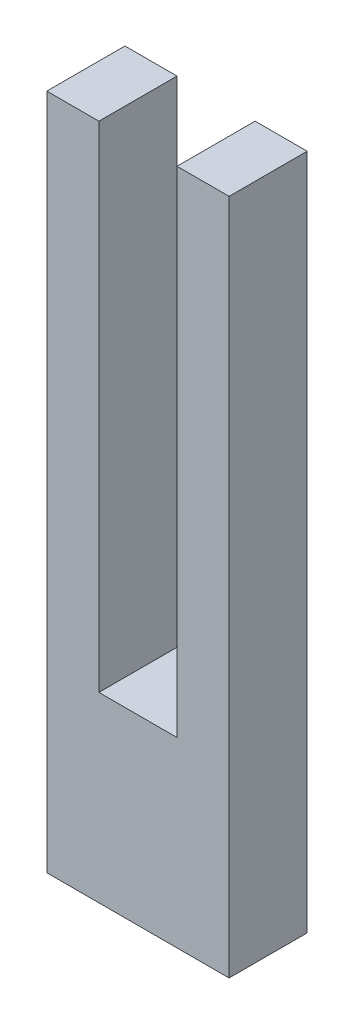
ISO-10303-21;
HEADER;
FILE_DESCRIPTION(('STEP AP214'),'2;1');
FILE_NAME('part.step','',(''),(''),'','','');
FILE_SCHEMA(('AUTOMOTIVE_DESIGN { 1 0 10303 214 1 1 1 1 }'));
ENDSEC;
DATA;
#1=APPLICATION_CONTEXT('core data for automotive mechanical design processes');
#2=APPLICATION_PROTOCOL_DEFINITION('international standard','automotive_design',2000,#1);
#3=PRODUCT_CONTEXT('',#1,'mechanical');
#4=PRODUCT('Part','Part','',(#3));
#5=PRODUCT_RELATED_PRODUCT_CATEGORY('part','',(#4));
#6=PRODUCT_DEFINITION_FORMATION('','',#4);
#7=PRODUCT_DEFINITION_CONTEXT('part definition',#1,'design');
#8=PRODUCT_DEFINITION('design','',#6,#7);
#9=PRODUCT_DEFINITION_SHAPE('','',#8);
#10=(LENGTH_UNIT() NAMED_UNIT(*) SI_UNIT(.MILLI.,.METRE.));
#11=(NAMED_UNIT(*) PLANE_ANGLE_UNIT() SI_UNIT($,.RADIAN.));
#12=(NAMED_UNIT(*) SI_UNIT($,.STERADIAN.) SOLID_ANGLE_UNIT());
#13=UNCERTAINTY_MEASURE_WITH_UNIT(LENGTH_MEASURE(1.E-05),#10,'distance_accuracy_value','');
#14=(GEOMETRIC_REPRESENTATION_CONTEXT(3) GLOBAL_UNCERTAINTY_ASSIGNED_CONTEXT((#13)) GLOBAL_UNIT_ASSIGNED_CONTEXT((#10,
#11,#12)) REPRESENTATION_CONTEXT('',''));
#15=CARTESIAN_POINT('',(0.,0.,0.));
#16=DIRECTION('',(0.,0.,1.));
#17=DIRECTION('',(1.,0.,0.));
#18=AXIS2_PLACEMENT_3D('',#15,#16,#17);
#19=CARTESIAN_POINT('',(0.,26.,3.));
#20=DIRECTION('',(1.,0.,0.));
#21=DIRECTION('',(0.,1.,0.));
#22=AXIS2_PLACEMENT_3D('',#19,#20,#21);
#23=PLANE('',#22);
#24=DIRECTION('',(0.,-1.,0.));
#25=VECTOR('',#24,1.);
#26=CARTESIAN_POINT('',(0.,26.,0.));
#27=LINE('',#26,#25);
#28=CARTESIAN_POINT('',(0.,26.,0.));
#29=VERTEX_POINT('',#28);
#30=CARTESIAN_POINT('',(0.,0.,0.));
#31=VERTEX_POINT('',#30);
#32=EDGE_CURVE('E147',#29,#31,#27,.T.);
#33=ORIENTED_EDGE('',*,*,#32,.T.);
#34=DIRECTION('',(0.,0.,-1.));
#35=VECTOR('',#34,1.);
#36=CARTESIAN_POINT('',(0.,0.,3.));
#37=LINE('',#36,#35);
#38=CARTESIAN_POINT('',(0.,0.,3.));
#39=VERTEX_POINT('',#38);
#40=EDGE_CURVE('E11',#39,#31,#37,.T.);
#41=ORIENTED_EDGE('',*,*,#40,.F.);
#42=DIRECTION('',(0.,-1.,0.));
#43=VECTOR('',#42,1.);
#44=CARTESIAN_POINT('',(0.,26.,3.));
#45=LINE('',#44,#43);
#46=CARTESIAN_POINT('',(0.,26.,3.));
#47=VERTEX_POINT('',#46);
#48=EDGE_CURVE('E166',#47,#39,#45,.T.);
#49=ORIENTED_EDGE('',*,*,#48,.F.);
#50=DIRECTION('',(0.,0.,-1.));
#51=VECTOR('',#50,1.);
#52=CARTESIAN_POINT('',(0.,26.,3.));
#53=LINE('',#52,#51);
#54=EDGE_CURVE('E145',#47,#29,#53,.T.);
#55=ORIENTED_EDGE('',*,*,#54,.T.);
#56=EDGE_LOOP('',(#33,#41,#49,#55));
#57=FACE_BOUND('',#56,.T.);
#58=ADVANCED_FACE('F44',(#57),#23,.F.);
#59=CARTESIAN_POINT('',(0.,0.,3.));
#60=DIRECTION('',(0.,1.,0.));
#61=DIRECTION('',(0.,0.,1.));
#62=AXIS2_PLACEMENT_3D('',#59,#60,#61);
#63=PLANE('',#62);
#64=DIRECTION('',(1.,0.,0.));
#65=VECTOR('',#64,1.);
#66=CARTESIAN_POINT('',(0.,0.,0.));
#67=LINE('',#66,#65);
#68=CARTESIAN_POINT('',(7.,0.,0.));
#69=VERTEX_POINT('',#68);
#70=EDGE_CURVE('E148',#31,#69,#67,.T.);
#71=ORIENTED_EDGE('',*,*,#70,.T.);
#72=DIRECTION('',(0.,0.,-1.));
#73=VECTOR('',#72,1.);
#74=CARTESIAN_POINT('',(7.,0.,3.));
#75=LINE('',#74,#73);
#76=CARTESIAN_POINT('',(7.,0.,3.));
#77=VERTEX_POINT('',#76);
#78=EDGE_CURVE('E53',#77,#69,#75,.T.);
#79=ORIENTED_EDGE('',*,*,#78,.F.);
#80=DIRECTION('',(1.,0.,0.));
#81=VECTOR('',#80,1.);
#82=CARTESIAN_POINT('',(0.,0.,3.));
#83=LINE('',#82,#81);
#84=EDGE_CURVE('E103',#39,#77,#83,.T.);
#85=ORIENTED_EDGE('',*,*,#84,.F.);
#86=ORIENTED_EDGE('',*,*,#40,.T.);
#87=EDGE_LOOP('',(#71,#79,#85,#86));
#88=FACE_BOUND('',#87,.T.);
#89=ADVANCED_FACE('F215',(#88),#63,.F.);
#90=CARTESIAN_POINT('',(7.,0.,3.));
#91=DIRECTION('',(-1.,0.,0.));
#92=DIRECTION('',(0.,0.,1.));
#93=AXIS2_PLACEMENT_3D('',#90,#91,#92);
#94=PLANE('',#93);
#95=DIRECTION('',(0.,1.,0.));
#96=VECTOR('',#95,1.);
#97=CARTESIAN_POINT('',(7.,0.,0.));
#98=LINE('',#97,#96);
#99=CARTESIAN_POINT('',(7.,26.,0.));
#100=VERTEX_POINT('',#99);
#101=EDGE_CURVE('E154',#69,#100,#98,.T.);
#102=ORIENTED_EDGE('',*,*,#101,.T.);
#103=DIRECTION('',(0.,0.,-1.));
#104=VECTOR('',#103,1.);
#105=CARTESIAN_POINT('',(7.,26.,3.));
#106=LINE('',#105,#104);
#107=CARTESIAN_POINT('',(7.,26.,3.));
#108=VERTEX_POINT('',#107);
#109=EDGE_CURVE('E177',#108,#100,#106,.T.);
#110=ORIENTED_EDGE('',*,*,#109,.F.);
#111=DIRECTION('',(0.,1.,0.));
#112=VECTOR('',#111,1.);
#113=CARTESIAN_POINT('',(7.,0.,3.));
#114=LINE('',#113,#112);
#115=EDGE_CURVE('E188',#77,#108,#114,.T.);
#116=ORIENTED_EDGE('',*,*,#115,.F.);
#117=ORIENTED_EDGE('',*,*,#78,.T.);
#118=EDGE_LOOP('',(#102,#110,#116,#117));
#119=FACE_BOUND('',#118,.T.);
#120=ADVANCED_FACE('F190',(#119),#94,.F.);
#121=CARTESIAN_POINT('',(7.,26.,3.));
#122=DIRECTION('',(0.,-1.,0.));
#123=DIRECTION('',(0.,0.,-1.));
#124=AXIS2_PLACEMENT_3D('',#121,#122,#123);
#125=PLANE('',#124);
#126=DIRECTION('',(-1.,0.,0.));
#127=VECTOR('',#126,1.);
#128=CARTESIAN_POINT('',(7.,26.,0.));
#129=LINE('',#128,#127);
#130=CARTESIAN_POINT('',(5.,26.,0.));
#131=VERTEX_POINT('',#130);
#132=EDGE_CURVE('E157',#100,#131,#129,.T.);
#133=ORIENTED_EDGE('',*,*,#132,.T.);
#134=DIRECTION('',(0.,0.,-1.));
#135=VECTOR('',#134,1.);
#136=CARTESIAN_POINT('',(5.,26.,3.));
#137=LINE('',#136,#135);
#138=CARTESIAN_POINT('',(5.,26.,3.));
#139=VERTEX_POINT('',#138);
#140=EDGE_CURVE('E172',#139,#131,#137,.T.);
#141=ORIENTED_EDGE('',*,*,#140,.F.);
#142=DIRECTION('',(-1.,0.,0.));
#143=VECTOR('',#142,1.);
#144=CARTESIAN_POINT('',(7.,26.,3.));
#145=LINE('',#144,#143);
#146=EDGE_CURVE('E205',#108,#139,#145,.T.);
#147=ORIENTED_EDGE('',*,*,#146,.F.);
#148=ORIENTED_EDGE('',*,*,#109,.T.);
#149=EDGE_LOOP('',(#133,#141,#147,#148));
#150=FACE_BOUND('',#149,.T.);
#151=ADVANCED_FACE('F197',(#150),#125,.F.);
#152=CARTESIAN_POINT('',(5.,7.,3.));
#153=DIRECTION('',(1.,0.,0.));
#154=DIRECTION('',(0.,0.,-1.));
#155=AXIS2_PLACEMENT_3D('',#152,#153,#154);
#156=PLANE('',#155);
#157=DIRECTION('',(0.,-1.,0.));
#158=VECTOR('',#157,1.);
#159=CARTESIAN_POINT('',(5.,7.,0.));
#160=LINE('',#159,#158);
#161=CARTESIAN_POINT('',(5.,7.,0.));
#162=VERTEX_POINT('',#161);
#163=EDGE_CURVE('E159',#131,#162,#160,.T.);
#164=ORIENTED_EDGE('',*,*,#163,.T.);
#165=DIRECTION('',(0.,0.,-1.));
#166=VECTOR('',#165,1.);
#167=CARTESIAN_POINT('',(5.,7.,3.));
#168=LINE('',#167,#166);
#169=CARTESIAN_POINT('',(5.,7.,3.));
#170=VERTEX_POINT('',#169);
#171=EDGE_CURVE('E134',#170,#162,#168,.T.);
#172=ORIENTED_EDGE('',*,*,#171,.F.);
#173=DIRECTION('',(0.,-1.,0.));
#174=VECTOR('',#173,1.);
#175=CARTESIAN_POINT('',(5.,7.,3.));
#176=LINE('',#175,#174);
#177=EDGE_CURVE('E125',#139,#170,#176,.T.);
#178=ORIENTED_EDGE('',*,*,#177,.F.);
#179=ORIENTED_EDGE('',*,*,#140,.T.);
#180=EDGE_LOOP('',(#164,#172,#178,#179));
#181=FACE_BOUND('',#180,.T.);
#182=ADVANCED_FACE('F200',(#181),#156,.F.);
#183=CARTESIAN_POINT('',(2.,7.,3.));
#184=DIRECTION('',(0.,-1.,0.));
#185=DIRECTION('',(1.,0.,0.));
#186=AXIS2_PLACEMENT_3D('',#183,#184,#185);
#187=PLANE('',#186);
#188=DIRECTION('',(-1.,0.,0.));
#189=VECTOR('',#188,1.);
#190=CARTESIAN_POINT('',(2.,7.,0.));
#191=LINE('',#190,#189);
#192=CARTESIAN_POINT('',(2.,7.,0.));
#193=VERTEX_POINT('',#192);
#194=EDGE_CURVE('E133',#162,#193,#191,.T.);
#195=ORIENTED_EDGE('',*,*,#194,.T.);
#196=DIRECTION('',(0.,0.,-1.));
#197=VECTOR('',#196,1.);
#198=CARTESIAN_POINT('',(2.,7.,3.));
#199=LINE('',#198,#197);
#200=CARTESIAN_POINT('',(2.,7.,3.));
#201=VERTEX_POINT('',#200);
#202=EDGE_CURVE('E127',#201,#193,#199,.T.);
#203=ORIENTED_EDGE('',*,*,#202,.F.);
#204=DIRECTION('',(-1.,0.,0.));
#205=VECTOR('',#204,1.);
#206=CARTESIAN_POINT('',(2.,7.,3.));
#207=LINE('',#206,#205);
#208=EDGE_CURVE('E119',#170,#201,#207,.T.);
#209=ORIENTED_EDGE('',*,*,#208,.F.);
#210=ORIENTED_EDGE('',*,*,#171,.T.);
#211=EDGE_LOOP('',(#195,#203,#209,#210));
#212=FACE_BOUND('',#211,.T.);
#213=ADVANCED_FACE('F131',(#212),#187,.F.);
#214=CARTESIAN_POINT('',(2.,7.,3.));
#215=DIRECTION('',(-1.,0.,0.));
#216=DIRECTION('',(0.,0.,1.));
#217=AXIS2_PLACEMENT_3D('',#214,#215,#216);
#218=PLANE('',#217);
#219=DIRECTION('',(0.,1.,0.));
#220=VECTOR('',#219,1.);
#221=CARTESIAN_POINT('',(2.,7.,0.));
#222=LINE('',#221,#220);
#223=CARTESIAN_POINT('',(2.,26.,0.));
#224=VERTEX_POINT('',#223);
#225=EDGE_CURVE('E91',#193,#224,#222,.T.);
#226=ORIENTED_EDGE('',*,*,#225,.T.);
#227=DIRECTION('',(0.,0.,-1.));
#228=VECTOR('',#227,1.);
#229=CARTESIAN_POINT('',(2.,26.,3.));
#230=LINE('',#229,#228);
#231=CARTESIAN_POINT('',(2.,26.,3.));
#232=VERTEX_POINT('',#231);
#233=EDGE_CURVE('E136',#232,#224,#230,.T.);
#234=ORIENTED_EDGE('',*,*,#233,.F.);
#235=DIRECTION('',(0.,1.,0.));
#236=VECTOR('',#235,1.);
#237=CARTESIAN_POINT('',(2.,7.,3.));
#238=LINE('',#237,#236);
#239=EDGE_CURVE('E122',#201,#232,#238,.T.);
#240=ORIENTED_EDGE('',*,*,#239,.F.);
#241=ORIENTED_EDGE('',*,*,#202,.T.);
#242=EDGE_LOOP('',(#226,#234,#240,#241));
#243=FACE_BOUND('',#242,.T.);
#244=ADVANCED_FACE('F138',(#243),#218,.F.);
#245=CARTESIAN_POINT('',(2.,26.,3.));
#246=DIRECTION('',(0.,-1.,0.));
#247=DIRECTION('',(0.,0.,-1.));
#248=AXIS2_PLACEMENT_3D('',#245,#246,#247);
#249=PLANE('',#248);
#250=DIRECTION('',(-1.,0.,0.));
#251=VECTOR('',#250,1.);
#252=CARTESIAN_POINT('',(2.,26.,0.));
#253=LINE('',#252,#251);
#254=EDGE_CURVE('E100',#224,#29,#253,.T.);
#255=ORIENTED_EDGE('',*,*,#254,.T.);
#256=ORIENTED_EDGE('',*,*,#54,.F.);
#257=DIRECTION('',(-1.,0.,0.));
#258=VECTOR('',#257,1.);
#259=CARTESIAN_POINT('',(2.,26.,3.));
#260=LINE('',#259,#258);
#261=EDGE_CURVE('E62',#232,#47,#260,.T.);
#262=ORIENTED_EDGE('',*,*,#261,.F.);
#263=ORIENTED_EDGE('',*,*,#233,.T.);
#264=EDGE_LOOP('',(#255,#256,#262,#263));
#265=FACE_BOUND('',#264,.T.);
#266=ADVANCED_FACE('F229',(#265),#249,.F.);
#267=CARTESIAN_POINT('',(0.,0.,3.));
#268=DIRECTION('',(0.,0.,1.));
#269=DIRECTION('',(1.,0.,0.));
#270=AXIS2_PLACEMENT_3D('',#267,#268,#269);
#271=PLANE('',#270);
#272=ORIENTED_EDGE('',*,*,#48,.T.);
#273=ORIENTED_EDGE('',*,*,#84,.T.);
#274=ORIENTED_EDGE('',*,*,#115,.T.);
#275=ORIENTED_EDGE('',*,*,#146,.T.);
#276=ORIENTED_EDGE('',*,*,#177,.T.);
#277=ORIENTED_EDGE('',*,*,#208,.T.);
#278=ORIENTED_EDGE('',*,*,#239,.T.);
#279=ORIENTED_EDGE('',*,*,#261,.T.);
#280=EDGE_LOOP('',(#272,#273,#274,#275,#276,#277,#278,#279));
#281=FACE_BOUND('',#280,.T.);
#282=ADVANCED_FACE('F120',(#281),#271,.T.);
#283=CARTESIAN_POINT('',(0.,0.,0.));
#284=DIRECTION('',(0.,0.,1.));
#285=DIRECTION('',(1.,0.,0.));
#286=AXIS2_PLACEMENT_3D('',#283,#284,#285);
#287=PLANE('',#286);
#288=ORIENTED_EDGE('',*,*,#32,.F.);
#289=ORIENTED_EDGE('',*,*,#254,.F.);
#290=ORIENTED_EDGE('',*,*,#225,.F.);
#291=ORIENTED_EDGE('',*,*,#194,.F.);
#292=ORIENTED_EDGE('',*,*,#163,.F.);
#293=ORIENTED_EDGE('',*,*,#132,.F.);
#294=ORIENTED_EDGE('',*,*,#101,.F.);
#295=ORIENTED_EDGE('',*,*,#70,.F.);
#296=EDGE_LOOP('',(#288,#289,#290,#291,#292,#293,#294,#295));
#297=FACE_BOUND('',#296,.T.);
#298=ADVANCED_FACE('F194',(#297),#287,.F.);
#299=CLOSED_SHELL('',(#58,#89,#120,#151,#182,#213,#244,#266,#282,#298));
#300=MANIFOLD_SOLID_BREP('B2',#299);
#301=ADVANCED_BREP_SHAPE_REPRESENTATION('',(#18,#300),#14);
#302=SHAPE_DEFINITION_REPRESENTATION(#9,#301);
ENDSEC;
END-ISO-10303-21;
